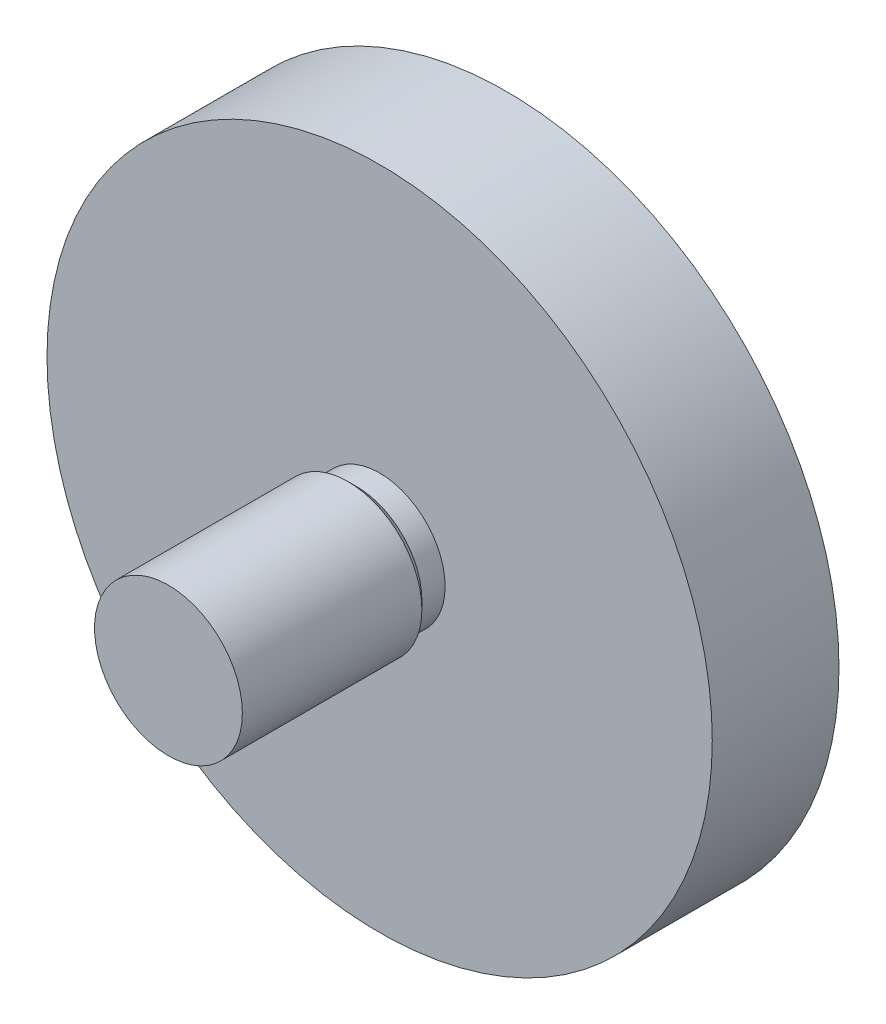
ISO-10303-21;
HEADER;
FILE_DESCRIPTION(('STEP AP214'),'2;1');
FILE_NAME('part.step','',(''),(''),'','','');
FILE_SCHEMA(('AUTOMOTIVE_DESIGN { 1 0 10303 214 1 1 1 1 }'));
ENDSEC;
DATA;
#1=APPLICATION_CONTEXT('core data for automotive mechanical design processes');
#2=APPLICATION_PROTOCOL_DEFINITION('international standard','automotive_design',2000,#1);
#3=PRODUCT_CONTEXT('',#1,'mechanical');
#4=PRODUCT('Part','Part','',(#3));
#5=PRODUCT_RELATED_PRODUCT_CATEGORY('part','',(#4));
#6=PRODUCT_DEFINITION_FORMATION('','',#4);
#7=PRODUCT_DEFINITION_CONTEXT('part definition',#1,'design');
#8=PRODUCT_DEFINITION('design','',#6,#7);
#9=PRODUCT_DEFINITION_SHAPE('','',#8);
#10=(LENGTH_UNIT() NAMED_UNIT(*) SI_UNIT(.MILLI.,.METRE.));
#11=(NAMED_UNIT(*) PLANE_ANGLE_UNIT() SI_UNIT($,.RADIAN.));
#12=(NAMED_UNIT(*) SI_UNIT($,.STERADIAN.) SOLID_ANGLE_UNIT());
#13=UNCERTAINTY_MEASURE_WITH_UNIT(LENGTH_MEASURE(1.E-05),#10,'distance_accuracy_value','');
#14=(GEOMETRIC_REPRESENTATION_CONTEXT(3) GLOBAL_UNCERTAINTY_ASSIGNED_CONTEXT((#13)) GLOBAL_UNIT_ASSIGNED_CONTEXT((#10,
#11,#12)) REPRESENTATION_CONTEXT('',''));
#15=CARTESIAN_POINT('',(0.,0.,0.));
#16=DIRECTION('',(0.,0.,1.));
#17=DIRECTION('',(1.,0.,0.));
#18=AXIS2_PLACEMENT_3D('',#15,#16,#17);
#19=CARTESIAN_POINT('',(0.,0.,-8.));
#20=DIRECTION('',(0.,0.,1.));
#21=DIRECTION('',(1.,0.,0.));
#22=AXIS2_PLACEMENT_3D('',#19,#20,#21);
#23=PLANE('',#22);
#24=CARTESIAN_POINT('',(0.,0.,-8.));
#25=DIRECTION('',(0.,0.,1.));
#26=DIRECTION('',(1.,0.,0.));
#27=AXIS2_PLACEMENT_3D('',#24,#25,#26);
#28=CIRCLE('',#27,6.);
#29=CARTESIAN_POINT('',(6.,0.,-8.));
#30=VERTEX_POINT('',#29);
#31=EDGE_CURVE('E10',#30,#30,#28,.T.);
#32=ORIENTED_EDGE('',*,*,#31,.F.);
#33=EDGE_LOOP('',(#32));
#34=FACE_BOUND('',#33,.T.);
#35=ADVANCED_FACE('F31',(#34),#23,.F.);
#36=CARTESIAN_POINT('',(0.,0.,-8.));
#37=DIRECTION('',(0.,0.,1.));
#38=DIRECTION('',(1.,0.,0.));
#39=AXIS2_PLACEMENT_3D('',#36,#37,#38);
#40=CYLINDRICAL_SURFACE('',#39,6.);
#41=CARTESIAN_POINT('',(0.,0.,0.));
#42=DIRECTION('',(0.,0.,1.));
#43=DIRECTION('',(1.,0.,0.));
#44=AXIS2_PLACEMENT_3D('',#41,#42,#43);
#45=CIRCLE('',#44,6.);
#46=CARTESIAN_POINT('',(6.,0.,0.));
#47=VERTEX_POINT('',#46);
#48=EDGE_CURVE('E37',#47,#47,#45,.T.);
#49=ORIENTED_EDGE('',*,*,#48,.F.);
#50=EDGE_LOOP('',(#49));
#51=FACE_BOUND('',#50,.T.);
#52=ORIENTED_EDGE('',*,*,#31,.T.);
#53=EDGE_LOOP('',(#52));
#54=FACE_BOUND('',#53,.T.);
#55=ADVANCED_FACE('F97',(#51,#54),#40,.T.);
#56=CARTESIAN_POINT('',(0.,6.,0.));
#57=DIRECTION('',(0.,0.,1.));
#58=DIRECTION('',(1.,0.,0.));
#59=AXIS2_PLACEMENT_3D('',#56,#57,#58);
#60=PLANE('',#59);
#61=CARTESIAN_POINT('',(0.,0.,0.));
#62=DIRECTION('',(0.,0.,1.));
#63=DIRECTION('',(1.,0.,0.));
#64=AXIS2_PLACEMENT_3D('',#61,#62,#63);
#65=CIRCLE('',#64,31.5);
#66=CARTESIAN_POINT('',(31.5,0.,0.));
#67=VERTEX_POINT('',#66);
#68=EDGE_CURVE('E41',#67,#67,#65,.T.);
#69=ORIENTED_EDGE('',*,*,#68,.F.);
#70=EDGE_LOOP('',(#69));
#71=FACE_BOUND('',#70,.T.);
#72=ORIENTED_EDGE('',*,*,#48,.T.);
#73=EDGE_LOOP('',(#72));
#74=FACE_BOUND('',#73,.T.);
#75=ADVANCED_FACE('F92',(#71,#74),#60,.F.);
#76=CARTESIAN_POINT('',(0.,0.,-8.));
#77=DIRECTION('',(0.,0.,1.));
#78=DIRECTION('',(1.,0.,0.));
#79=AXIS2_PLACEMENT_3D('',#76,#77,#78);
#80=CYLINDRICAL_SURFACE('',#79,31.5);
#81=CARTESIAN_POINT('',(0.,0.,12.));
#82=DIRECTION('',(0.,0.,1.));
#83=DIRECTION('',(1.,0.,0.));
#84=AXIS2_PLACEMENT_3D('',#81,#82,#83);
#85=CIRCLE('',#84,31.5);
#86=CARTESIAN_POINT('',(31.5,0.,12.));
#87=VERTEX_POINT('',#86);
#88=EDGE_CURVE('E45',#87,#87,#85,.T.);
#89=ORIENTED_EDGE('',*,*,#88,.F.);
#90=EDGE_LOOP('',(#89));
#91=FACE_BOUND('',#90,.T.);
#92=ORIENTED_EDGE('',*,*,#68,.T.);
#93=EDGE_LOOP('',(#92));
#94=FACE_BOUND('',#93,.T.);
#95=ADVANCED_FACE('F86',(#91,#94),#80,.T.);
#96=CARTESIAN_POINT('',(0.,31.5,12.));
#97=DIRECTION('',(0.,0.,-1.));
#98=DIRECTION('',(-1.,0.,0.));
#99=AXIS2_PLACEMENT_3D('',#96,#97,#98);
#100=PLANE('',#99);
#101=CARTESIAN_POINT('',(0.,0.,12.));
#102=DIRECTION('',(0.,0.,1.));
#103=DIRECTION('',(1.,0.,0.));
#104=AXIS2_PLACEMENT_3D('',#101,#102,#103);
#105=CIRCLE('',#104,6.2);
#106=CARTESIAN_POINT('',(6.2,0.,12.));
#107=VERTEX_POINT('',#106);
#108=EDGE_CURVE('E50',#107,#107,#105,.T.);
#109=ORIENTED_EDGE('',*,*,#108,.F.);
#110=EDGE_LOOP('',(#109));
#111=FACE_BOUND('',#110,.T.);
#112=ORIENTED_EDGE('',*,*,#88,.T.);
#113=EDGE_LOOP('',(#112));
#114=FACE_BOUND('',#113,.T.);
#115=ADVANCED_FACE('F80',(#111,#114),#100,.F.);
#116=CARTESIAN_POINT('',(0.,0.,-8.));
#117=DIRECTION('',(0.,0.,1.));
#118=DIRECTION('',(1.,0.,0.));
#119=AXIS2_PLACEMENT_3D('',#116,#117,#118);
#120=CYLINDRICAL_SURFACE('',#119,6.2);
#121=CARTESIAN_POINT('',(0.,0.,14.2));
#122=DIRECTION('',(0.,0.,1.));
#123=DIRECTION('',(1.,0.,0.));
#124=AXIS2_PLACEMENT_3D('',#121,#122,#123);
#125=CIRCLE('',#124,6.2);
#126=CARTESIAN_POINT('',(6.2,0.,14.2));
#127=VERTEX_POINT('',#126);
#128=EDGE_CURVE('E53',#127,#127,#125,.T.);
#129=ORIENTED_EDGE('',*,*,#128,.F.);
#130=EDGE_LOOP('',(#129));
#131=FACE_BOUND('',#130,.T.);
#132=ORIENTED_EDGE('',*,*,#108,.T.);
#133=EDGE_LOOP('',(#132));
#134=FACE_BOUND('',#133,.T.);
#135=ADVANCED_FACE('F74',(#131,#134),#120,.T.);
#136=CARTESIAN_POINT('',(0.,0.,14.2));
#137=DIRECTION('',(0.,0.,1.));
#138=DIRECTION('',(1.,0.,0.));
#139=AXIS2_PLACEMENT_3D('',#136,#137,#138);
#140=CONICAL_SURFACE('',#139,6.2,0.78539816339745);
#141=CARTESIAN_POINT('',(0.,0.,15.));
#142=DIRECTION('',(0.,0.,1.));
#143=DIRECTION('',(1.,0.,0.));
#144=AXIS2_PLACEMENT_3D('',#141,#142,#143);
#145=CIRCLE('',#144,7.);
#146=CARTESIAN_POINT('',(7.,0.,15.));
#147=VERTEX_POINT('',#146);
#148=EDGE_CURVE('E56',#147,#147,#145,.T.);
#149=ORIENTED_EDGE('',*,*,#148,.F.);
#150=EDGE_LOOP('',(#149));
#151=FACE_BOUND('',#150,.T.);
#152=ORIENTED_EDGE('',*,*,#128,.T.);
#153=EDGE_LOOP('',(#152));
#154=FACE_BOUND('',#153,.T.);
#155=ADVANCED_FACE('F68',(#151,#154),#140,.T.);
#156=CARTESIAN_POINT('',(0.,0.,-8.));
#157=DIRECTION('',(0.,0.,1.));
#158=DIRECTION('',(1.,0.,0.));
#159=AXIS2_PLACEMENT_3D('',#156,#157,#158);
#160=CYLINDRICAL_SURFACE('',#159,7.);
#161=CARTESIAN_POINT('',(0.,0.,32.));
#162=DIRECTION('',(0.,0.,1.));
#163=DIRECTION('',(1.,0.,0.));
#164=AXIS2_PLACEMENT_3D('',#161,#162,#163);
#165=CIRCLE('',#164,7.);
#166=CARTESIAN_POINT('',(7.,0.,32.));
#167=VERTEX_POINT('',#166);
#168=EDGE_CURVE('E59',#167,#167,#165,.T.);
#169=ORIENTED_EDGE('',*,*,#168,.F.);
#170=EDGE_LOOP('',(#169));
#171=FACE_BOUND('',#170,.T.);
#172=ORIENTED_EDGE('',*,*,#148,.T.);
#173=EDGE_LOOP('',(#172));
#174=FACE_BOUND('',#173,.T.);
#175=ADVANCED_FACE('F65',(#171,#174),#160,.T.);
#176=CARTESIAN_POINT('',(0.,7.,32.));
#177=DIRECTION('',(0.,0.,-1.));
#178=DIRECTION('',(-1.,0.,0.));
#179=AXIS2_PLACEMENT_3D('',#176,#177,#178);
#180=PLANE('',#179);
#181=ORIENTED_EDGE('',*,*,#168,.T.);
#182=EDGE_LOOP('',(#181));
#183=FACE_BOUND('',#182,.T.);
#184=ADVANCED_FACE('F63',(#183),#180,.F.);
#185=CLOSED_SHELL('',(#35,#55,#75,#95,#115,#135,#155,#175,#184));
#186=MANIFOLD_SOLID_BREP('B2',#185);
#187=ADVANCED_BREP_SHAPE_REPRESENTATION('',(#18,#186),#14);
#188=SHAPE_DEFINITION_REPRESENTATION(#9,#187);
ENDSEC;
END-ISO-10303-21;
